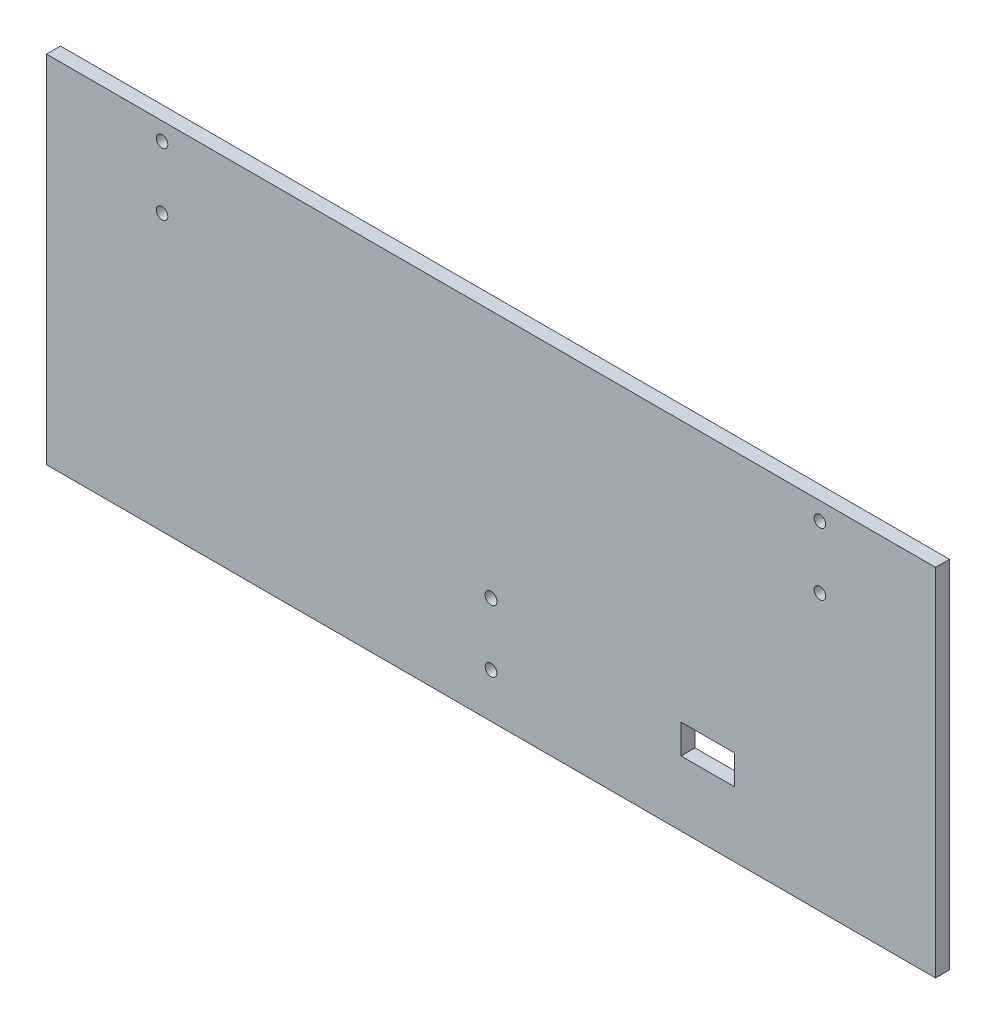
ISO-10303-21;
HEADER;
FILE_DESCRIPTION(('STEP AP214'),'2;1');
FILE_NAME('part.step','',(''),(''),'','','');
FILE_SCHEMA(('AUTOMOTIVE_DESIGN { 1 0 10303 214 1 1 1 1 }'));
ENDSEC;
DATA;
#1=APPLICATION_CONTEXT('core data for automotive mechanical design processes');
#2=APPLICATION_PROTOCOL_DEFINITION('international standard','automotive_design',2000,#1);
#3=PRODUCT_CONTEXT('',#1,'mechanical');
#4=PRODUCT('Part','Part','',(#3));
#5=PRODUCT_RELATED_PRODUCT_CATEGORY('part','',(#4));
#6=PRODUCT_DEFINITION_FORMATION('','',#4);
#7=PRODUCT_DEFINITION_CONTEXT('part definition',#1,'design');
#8=PRODUCT_DEFINITION('design','',#6,#7);
#9=PRODUCT_DEFINITION_SHAPE('','',#8);
#10=(LENGTH_UNIT() NAMED_UNIT(*) SI_UNIT(.MILLI.,.METRE.));
#11=(NAMED_UNIT(*) PLANE_ANGLE_UNIT() SI_UNIT($,.RADIAN.));
#12=(NAMED_UNIT(*) SI_UNIT($,.STERADIAN.) SOLID_ANGLE_UNIT());
#13=UNCERTAINTY_MEASURE_WITH_UNIT(LENGTH_MEASURE(1.E-05),#10,'distance_accuracy_value','');
#14=(GEOMETRIC_REPRESENTATION_CONTEXT(3) GLOBAL_UNCERTAINTY_ASSIGNED_CONTEXT((#13)) GLOBAL_UNIT_ASSIGNED_CONTEXT((#10,
#11,#12)) REPRESENTATION_CONTEXT('',''));
#15=CARTESIAN_POINT('',(0.,0.,0.));
#16=DIRECTION('',(0.,0.,1.));
#17=DIRECTION('',(1.,0.,0.));
#18=AXIS2_PLACEMENT_3D('',#15,#16,#17);
#19=CARTESIAN_POINT('',(0.,0.,4.));
#20=DIRECTION('',(0.,0.,-1.));
#21=DIRECTION('',(-1.,0.,0.));
#22=AXIS2_PLACEMENT_3D('',#19,#20,#21);
#23=PLANE('',#22);
#24=CARTESIAN_POINT('',(220.98,78.74,4.));
#25=DIRECTION('',(0.,0.,1.));
#26=DIRECTION('',(1.,0.,0.));
#27=AXIS2_PLACEMENT_3D('',#24,#25,#26);
#28=CIRCLE('',#27,1.65100000000002);
#29=CARTESIAN_POINT('',(222.631,78.74,4.));
#30=VERTEX_POINT('',#29);
#31=EDGE_CURVE('E160',#30,#30,#28,.T.);
#32=ORIENTED_EDGE('',*,*,#31,.F.);
#33=EDGE_LOOP('',(#32));
#34=FACE_BOUND('',#33,.T.);
#35=CARTESIAN_POINT('',(220.98,96.52,4.));
#36=DIRECTION('',(0.,0.,1.));
#37=DIRECTION('',(1.,0.,0.));
#38=AXIS2_PLACEMENT_3D('',#35,#36,#37);
#39=CIRCLE('',#38,1.65100000000002);
#40=CARTESIAN_POINT('',(222.631,96.52,4.));
#41=VERTEX_POINT('',#40);
#42=EDGE_CURVE('E168',#41,#41,#39,.T.);
#43=ORIENTED_EDGE('',*,*,#42,.F.);
#44=EDGE_LOOP('',(#43));
#45=FACE_BOUND('',#44,.T.);
#46=CARTESIAN_POINT('',(33.0199996785421,78.7446075022681,4.));
#47=DIRECTION('',(0.,0.,1.));
#48=DIRECTION('',(1.,0.,0.));
#49=AXIS2_PLACEMENT_3D('',#46,#47,#48);
#50=CIRCLE('',#49,1.65100000000001);
#51=CARTESIAN_POINT('',(34.6709996785421,78.7446075022681,4.));
#52=VERTEX_POINT('',#51);
#53=EDGE_CURVE('E176',#52,#52,#50,.T.);
#54=ORIENTED_EDGE('',*,*,#53,.F.);
#55=EDGE_LOOP('',(#54));
#56=FACE_BOUND('',#55,.T.);
#57=CARTESIAN_POINT('',(33.02,96.5246075022681,4.));
#58=DIRECTION('',(0.,0.,1.));
#59=DIRECTION('',(1.,0.,0.));
#60=AXIS2_PLACEMENT_3D('',#57,#58,#59);
#61=CIRCLE('',#60,1.65100000000001);
#62=CARTESIAN_POINT('',(34.671,96.5246075022681,4.));
#63=VERTEX_POINT('',#62);
#64=EDGE_CURVE('E184',#63,#63,#61,.T.);
#65=ORIENTED_EDGE('',*,*,#64,.F.);
#66=EDGE_LOOP('',(#65));
#67=FACE_BOUND('',#66,.T.);
#68=DIRECTION('',(0.,-1.,0.));
#69=VECTOR('',#68,1.);
#70=CARTESIAN_POINT('',(0.,0.,4.));
#71=LINE('',#70,#69);
#72=CARTESIAN_POINT('',(0.,101.6,4.));
#73=VERTEX_POINT('',#72);
#74=CARTESIAN_POINT('',(0.,0.,4.));
#75=VERTEX_POINT('',#74);
#76=EDGE_CURVE('E192',#73,#75,#71,.T.);
#77=ORIENTED_EDGE('',*,*,#76,.T.);
#78=DIRECTION('',(1.,0.,0.));
#79=VECTOR('',#78,1.);
#80=CARTESIAN_POINT('',(0.,0.,4.));
#81=LINE('',#80,#79);
#82=CARTESIAN_POINT('',(254.,0.,4.));
#83=VERTEX_POINT('',#82);
#84=EDGE_CURVE('E196',#75,#83,#81,.T.);
#85=ORIENTED_EDGE('',*,*,#84,.T.);
#86=DIRECTION('',(0.,1.,0.));
#87=VECTOR('',#86,1.);
#88=CARTESIAN_POINT('',(254.,101.6,4.));
#89=LINE('',#88,#87);
#90=CARTESIAN_POINT('',(254.,101.6,4.));
#91=VERTEX_POINT('',#90);
#92=EDGE_CURVE('E200',#83,#91,#89,.T.);
#93=ORIENTED_EDGE('',*,*,#92,.T.);
#94=DIRECTION('',(-1.,0.,0.));
#95=VECTOR('',#94,1.);
#96=CARTESIAN_POINT('',(0.,101.6,4.));
#97=LINE('',#96,#95);
#98=EDGE_CURVE('E203',#91,#73,#97,.T.);
#99=ORIENTED_EDGE('',*,*,#98,.T.);
#100=EDGE_LOOP('',(#77,#85,#93,#99));
#101=FACE_BOUND('',#100,.T.);
#102=DIRECTION('',(0.,1.,0.));
#103=VECTOR('',#102,1.);
#104=CARTESIAN_POINT('',(196.576378973253,26.9715919136581,4.));
#105=LINE('',#104,#103);
#106=CARTESIAN_POINT('',(196.576378973253,18.5895919136581,4.));
#107=VERTEX_POINT('',#106);
#108=CARTESIAN_POINT('',(196.576378973253,26.9715919136581,4.));
#109=VERTEX_POINT('',#108);
#110=EDGE_CURVE('E109',#107,#109,#105,.T.);
#111=ORIENTED_EDGE('',*,*,#110,.F.);
#112=DIRECTION('',(1.,0.,0.));
#113=VECTOR('',#112,1.);
#114=CARTESIAN_POINT('',(181.285578973253,18.5895919136581,4.));
#115=LINE('',#114,#113);
#116=CARTESIAN_POINT('',(181.285578973253,18.5895919136581,4.));
#117=VERTEX_POINT('',#116);
#118=EDGE_CURVE('E136',#117,#107,#115,.T.);
#119=ORIENTED_EDGE('',*,*,#118,.F.);
#120=DIRECTION('',(0.,-1.,0.));
#121=VECTOR('',#120,1.);
#122=CARTESIAN_POINT('',(181.285578973253,26.9715919136581,4.));
#123=LINE('',#122,#121);
#124=CARTESIAN_POINT('',(181.285578973253,26.9715919136581,4.));
#125=VERTEX_POINT('',#124);
#126=EDGE_CURVE('E132',#125,#117,#123,.T.);
#127=ORIENTED_EDGE('',*,*,#126,.F.);
#128=DIRECTION('',(-1.,0.,0.));
#129=VECTOR('',#128,1.);
#130=CARTESIAN_POINT('',(181.285578973253,26.9715919136581,4.));
#131=LINE('',#130,#129);
#132=EDGE_CURVE('E118',#109,#125,#131,.T.);
#133=ORIENTED_EDGE('',*,*,#132,.F.);
#134=EDGE_LOOP('',(#111,#119,#127,#133));
#135=FACE_BOUND('',#134,.T.);
#136=CARTESIAN_POINT('',(127.,30.48,4.));
#137=DIRECTION('',(0.,0.,1.));
#138=DIRECTION('',(1.,0.,0.));
#139=AXIS2_PLACEMENT_3D('',#136,#137,#138);
#140=CIRCLE('',#139,1.6891);
#141=CARTESIAN_POINT('',(128.6891,30.48,4.));
#142=VERTEX_POINT('',#141);
#143=EDGE_CURVE('E144',#142,#142,#140,.T.);
#144=ORIENTED_EDGE('',*,*,#143,.F.);
#145=EDGE_LOOP('',(#144));
#146=FACE_BOUND('',#145,.T.);
#147=CARTESIAN_POINT('',(127.,12.7,4.));
#148=DIRECTION('',(0.,0.,1.));
#149=DIRECTION('',(1.,0.,0.));
#150=AXIS2_PLACEMENT_3D('',#147,#148,#149);
#151=CIRCLE('',#150,1.66369999999999);
#152=CARTESIAN_POINT('',(128.6637,12.7,4.));
#153=VERTEX_POINT('',#152);
#154=EDGE_CURVE('E317',#153,#153,#151,.T.);
#155=ORIENTED_EDGE('',*,*,#154,.F.);
#156=EDGE_LOOP('',(#155));
#157=FACE_BOUND('',#156,.T.);
#158=ADVANCED_FACE('F43',(#34,#45,#56,#67,#101,#135,#146,#157),#23,.F.);
#159=CARTESIAN_POINT('',(0.,0.,0.));
#160=DIRECTION('',(0.,0.,-1.));
#161=DIRECTION('',(-1.,0.,0.));
#162=AXIS2_PLACEMENT_3D('',#159,#160,#161);
#163=PLANE('',#162);
#164=CARTESIAN_POINT('',(127.,30.48,0.));
#165=DIRECTION('',(0.,0.,1.));
#166=DIRECTION('',(1.,0.,0.));
#167=AXIS2_PLACEMENT_3D('',#164,#165,#166);
#168=CIRCLE('',#167,1.6891);
#169=CARTESIAN_POINT('',(128.6891,30.48,0.));
#170=VERTEX_POINT('',#169);
#171=EDGE_CURVE('E325',#170,#170,#168,.T.);
#172=ORIENTED_EDGE('',*,*,#171,.T.);
#173=EDGE_LOOP('',(#172));
#174=FACE_BOUND('',#173,.T.);
#175=CARTESIAN_POINT('',(220.98,96.52,0.));
#176=DIRECTION('',(0.,0.,1.));
#177=DIRECTION('',(1.,0.,0.));
#178=AXIS2_PLACEMENT_3D('',#175,#176,#177);
#179=CIRCLE('',#178,1.65100000000002);
#180=CARTESIAN_POINT('',(222.631,96.52,0.));
#181=VERTEX_POINT('',#180);
#182=EDGE_CURVE('E164',#181,#181,#179,.T.);
#183=ORIENTED_EDGE('',*,*,#182,.T.);
#184=EDGE_LOOP('',(#183));
#185=FACE_BOUND('',#184,.T.);
#186=CARTESIAN_POINT('',(33.02,96.5246075022681,0.));
#187=DIRECTION('',(0.,0.,1.));
#188=DIRECTION('',(1.,0.,0.));
#189=AXIS2_PLACEMENT_3D('',#186,#187,#188);
#190=CIRCLE('',#189,1.65100000000001);
#191=CARTESIAN_POINT('',(34.671,96.5246075022681,0.));
#192=VERTEX_POINT('',#191);
#193=EDGE_CURVE('E180',#192,#192,#190,.T.);
#194=ORIENTED_EDGE('',*,*,#193,.T.);
#195=EDGE_LOOP('',(#194));
#196=FACE_BOUND('',#195,.T.);
#197=DIRECTION('',(0.,-1.,0.));
#198=VECTOR('',#197,1.);
#199=CARTESIAN_POINT('',(0.,0.,0.));
#200=LINE('',#199,#198);
#201=CARTESIAN_POINT('',(0.,101.6,0.));
#202=VERTEX_POINT('',#201);
#203=CARTESIAN_POINT('',(0.,0.,0.));
#204=VERTEX_POINT('',#203);
#205=EDGE_CURVE('E188',#202,#204,#200,.T.);
#206=ORIENTED_EDGE('',*,*,#205,.F.);
#207=DIRECTION('',(-1.,0.,0.));
#208=VECTOR('',#207,1.);
#209=CARTESIAN_POINT('',(0.,101.6,0.));
#210=LINE('',#209,#208);
#211=CARTESIAN_POINT('',(254.,101.6,0.));
#212=VERTEX_POINT('',#211);
#213=EDGE_CURVE('E197',#212,#202,#210,.T.);
#214=ORIENTED_EDGE('',*,*,#213,.F.);
#215=DIRECTION('',(0.,1.,0.));
#216=VECTOR('',#215,1.);
#217=CARTESIAN_POINT('',(254.,101.6,0.));
#218=LINE('',#217,#216);
#219=CARTESIAN_POINT('',(254.,0.,0.));
#220=VERTEX_POINT('',#219);
#221=EDGE_CURVE('E213',#220,#212,#218,.T.);
#222=ORIENTED_EDGE('',*,*,#221,.F.);
#223=DIRECTION('',(1.,0.,0.));
#224=VECTOR('',#223,1.);
#225=CARTESIAN_POINT('',(0.,0.,0.));
#226=LINE('',#225,#224);
#227=EDGE_CURVE('E210',#204,#220,#226,.T.);
#228=ORIENTED_EDGE('',*,*,#227,.F.);
#229=EDGE_LOOP('',(#206,#214,#222,#228));
#230=FACE_BOUND('',#229,.T.);
#231=CARTESIAN_POINT('',(33.0199996785421,78.7446075022681,0.));
#232=DIRECTION('',(0.,0.,1.));
#233=DIRECTION('',(1.,0.,0.));
#234=AXIS2_PLACEMENT_3D('',#231,#232,#233);
#235=CIRCLE('',#234,1.65100000000001);
#236=CARTESIAN_POINT('',(34.6709996785421,78.7446075022681,0.));
#237=VERTEX_POINT('',#236);
#238=EDGE_CURVE('E172',#237,#237,#235,.T.);
#239=ORIENTED_EDGE('',*,*,#238,.T.);
#240=EDGE_LOOP('',(#239));
#241=FACE_BOUND('',#240,.T.);
#242=CARTESIAN_POINT('',(220.98,78.74,0.));
#243=DIRECTION('',(0.,0.,1.));
#244=DIRECTION('',(1.,0.,0.));
#245=AXIS2_PLACEMENT_3D('',#242,#243,#244);
#246=CIRCLE('',#245,1.65100000000002);
#247=CARTESIAN_POINT('',(222.631,78.74,0.));
#248=VERTEX_POINT('',#247);
#249=EDGE_CURVE('E127',#248,#248,#246,.T.);
#250=ORIENTED_EDGE('',*,*,#249,.T.);
#251=EDGE_LOOP('',(#250));
#252=FACE_BOUND('',#251,.T.);
#253=DIRECTION('',(1.,0.,0.));
#254=VECTOR('',#253,1.);
#255=CARTESIAN_POINT('',(181.285578973253,18.5895919136581,0.));
#256=LINE('',#255,#254);
#257=CARTESIAN_POINT('',(181.285578973253,18.5895919136581,0.));
#258=VERTEX_POINT('',#257);
#259=CARTESIAN_POINT('',(196.576378973253,18.5895919136581,0.));
#260=VERTEX_POINT('',#259);
#261=EDGE_CURVE('E119',#258,#260,#256,.T.);
#262=ORIENTED_EDGE('',*,*,#261,.T.);
#263=DIRECTION('',(0.,1.,0.));
#264=VECTOR('',#263,1.);
#265=CARTESIAN_POINT('',(196.576378973253,26.9715919136581,0.));
#266=LINE('',#265,#264);
#267=CARTESIAN_POINT('',(196.576378973253,26.9715919136581,0.));
#268=VERTEX_POINT('',#267);
#269=EDGE_CURVE('E67',#260,#268,#266,.T.);
#270=ORIENTED_EDGE('',*,*,#269,.T.);
#271=DIRECTION('',(-1.,0.,0.));
#272=VECTOR('',#271,1.);
#273=CARTESIAN_POINT('',(181.285578973253,26.9715919136581,0.));
#274=LINE('',#273,#272);
#275=CARTESIAN_POINT('',(181.285578973253,26.9715919136581,0.));
#276=VERTEX_POINT('',#275);
#277=EDGE_CURVE('E125',#268,#276,#274,.T.);
#278=ORIENTED_EDGE('',*,*,#277,.T.);
#279=DIRECTION('',(0.,-1.,0.));
#280=VECTOR('',#279,1.);
#281=CARTESIAN_POINT('',(181.285578973253,26.9715919136581,0.));
#282=LINE('',#281,#280);
#283=EDGE_CURVE('E147',#276,#258,#282,.T.);
#284=ORIENTED_EDGE('',*,*,#283,.T.);
#285=EDGE_LOOP('',(#262,#270,#278,#284));
#286=FACE_BOUND('',#285,.T.);
#287=CARTESIAN_POINT('',(127.,12.7,0.));
#288=DIRECTION('',(0.,0.,1.));
#289=DIRECTION('',(1.,0.,0.));
#290=AXIS2_PLACEMENT_3D('',#287,#288,#289);
#291=CIRCLE('',#290,1.66369999999999);
#292=CARTESIAN_POINT('',(128.6637,12.7,0.));
#293=VERTEX_POINT('',#292);
#294=EDGE_CURVE('E320',#293,#293,#291,.T.);
#295=ORIENTED_EDGE('',*,*,#294,.T.);
#296=EDGE_LOOP('',(#295));
#297=FACE_BOUND('',#296,.T.);
#298=ADVANCED_FACE('F236',(#174,#185,#196,#230,#241,#252,#286,#297),#163,.T.);
#299=CARTESIAN_POINT('',(0.,0.,4.));
#300=DIRECTION('',(1.,0.,0.));
#301=DIRECTION('',(0.,0.,-1.));
#302=AXIS2_PLACEMENT_3D('',#299,#300,#301);
#303=PLANE('',#302);
#304=ORIENTED_EDGE('',*,*,#205,.T.);
#305=DIRECTION('',(0.,0.,-1.));
#306=VECTOR('',#305,1.);
#307=CARTESIAN_POINT('',(0.,0.,4.));
#308=LINE('',#307,#306);
#309=EDGE_CURVE('E11',#75,#204,#308,.T.);
#310=ORIENTED_EDGE('',*,*,#309,.F.);
#311=ORIENTED_EDGE('',*,*,#76,.F.);
#312=DIRECTION('',(0.,0.,-1.));
#313=VECTOR('',#312,1.);
#314=CARTESIAN_POINT('',(0.,101.6,4.));
#315=LINE('',#314,#313);
#316=EDGE_CURVE('E206',#73,#202,#315,.T.);
#317=ORIENTED_EDGE('',*,*,#316,.T.);
#318=EDGE_LOOP('',(#304,#310,#311,#317));
#319=FACE_BOUND('',#318,.T.);
#320=ADVANCED_FACE('F45',(#319),#303,.F.);
#321=CARTESIAN_POINT('',(0.,0.,4.));
#322=DIRECTION('',(0.,1.,0.));
#323=DIRECTION('',(0.,0.,1.));
#324=AXIS2_PLACEMENT_3D('',#321,#322,#323);
#325=PLANE('',#324);
#326=ORIENTED_EDGE('',*,*,#227,.T.);
#327=DIRECTION('',(0.,0.,-1.));
#328=VECTOR('',#327,1.);
#329=CARTESIAN_POINT('',(254.,0.,4.));
#330=LINE('',#329,#328);
#331=EDGE_CURVE('E52',#83,#220,#330,.T.);
#332=ORIENTED_EDGE('',*,*,#331,.F.);
#333=ORIENTED_EDGE('',*,*,#84,.F.);
#334=ORIENTED_EDGE('',*,*,#309,.T.);
#335=EDGE_LOOP('',(#326,#332,#333,#334));
#336=FACE_BOUND('',#335,.T.);
#337=ADVANCED_FACE('F246',(#336),#325,.F.);
#338=CARTESIAN_POINT('',(254.,101.6,4.));
#339=DIRECTION('',(-1.,0.,0.));
#340=DIRECTION('',(0.,0.,1.));
#341=AXIS2_PLACEMENT_3D('',#338,#339,#340);
#342=PLANE('',#341);
#343=ORIENTED_EDGE('',*,*,#221,.T.);
#344=DIRECTION('',(0.,0.,-1.));
#345=VECTOR('',#344,1.);
#346=CARTESIAN_POINT('',(254.,101.6,4.));
#347=LINE('',#346,#345);
#348=EDGE_CURVE('E221',#91,#212,#347,.T.);
#349=ORIENTED_EDGE('',*,*,#348,.F.);
#350=ORIENTED_EDGE('',*,*,#92,.F.);
#351=ORIENTED_EDGE('',*,*,#331,.T.);
#352=EDGE_LOOP('',(#343,#349,#350,#351));
#353=FACE_BOUND('',#352,.T.);
#354=ADVANCED_FACE('F230',(#353),#342,.F.);
#355=CARTESIAN_POINT('',(0.,101.6,4.));
#356=DIRECTION('',(0.,-1.,0.));
#357=DIRECTION('',(0.,0.,-1.));
#358=AXIS2_PLACEMENT_3D('',#355,#356,#357);
#359=PLANE('',#358);
#360=ORIENTED_EDGE('',*,*,#213,.T.);
#361=ORIENTED_EDGE('',*,*,#316,.F.);
#362=ORIENTED_EDGE('',*,*,#98,.F.);
#363=ORIENTED_EDGE('',*,*,#348,.T.);
#364=EDGE_LOOP('',(#360,#361,#362,#363));
#365=FACE_BOUND('',#364,.T.);
#366=ADVANCED_FACE('F240',(#365),#359,.F.);
#367=CARTESIAN_POINT('',(33.02,96.5246075022681,4.));
#368=DIRECTION('',(0.,0.,-1.));
#369=DIRECTION('',(-1.,0.,0.));
#370=AXIS2_PLACEMENT_3D('',#367,#368,#369);
#371=CYLINDRICAL_SURFACE('',#370,1.65100000000001);
#372=ORIENTED_EDGE('',*,*,#64,.T.);
#373=EDGE_LOOP('',(#372));
#374=FACE_BOUND('',#373,.T.);
#375=ORIENTED_EDGE('',*,*,#193,.F.);
#376=EDGE_LOOP('',(#375));
#377=FACE_BOUND('',#376,.T.);
#378=ADVANCED_FACE('F264',(#374,#377),#371,.F.);
#379=CARTESIAN_POINT('',(33.0199996785421,78.7446075022681,4.));
#380=DIRECTION('',(0.,0.,-1.));
#381=DIRECTION('',(-1.,0.,0.));
#382=AXIS2_PLACEMENT_3D('',#379,#380,#381);
#383=CYLINDRICAL_SURFACE('',#382,1.65100000000001);
#384=ORIENTED_EDGE('',*,*,#53,.T.);
#385=EDGE_LOOP('',(#384));
#386=FACE_BOUND('',#385,.T.);
#387=ORIENTED_EDGE('',*,*,#238,.F.);
#388=EDGE_LOOP('',(#387));
#389=FACE_BOUND('',#388,.T.);
#390=ADVANCED_FACE('F271',(#386,#389),#383,.F.);
#391=CARTESIAN_POINT('',(220.98,96.52,4.));
#392=DIRECTION('',(0.,0.,-1.));
#393=DIRECTION('',(-1.,0.,0.));
#394=AXIS2_PLACEMENT_3D('',#391,#392,#393);
#395=CYLINDRICAL_SURFACE('',#394,1.65100000000002);
#396=ORIENTED_EDGE('',*,*,#42,.T.);
#397=EDGE_LOOP('',(#396));
#398=FACE_BOUND('',#397,.T.);
#399=ORIENTED_EDGE('',*,*,#182,.F.);
#400=EDGE_LOOP('',(#399));
#401=FACE_BOUND('',#400,.T.);
#402=ADVANCED_FACE('F276',(#398,#401),#395,.F.);
#403=CARTESIAN_POINT('',(220.98,78.74,4.));
#404=DIRECTION('',(0.,0.,-1.));
#405=DIRECTION('',(-1.,0.,0.));
#406=AXIS2_PLACEMENT_3D('',#403,#404,#405);
#407=CYLINDRICAL_SURFACE('',#406,1.65100000000002);
#408=ORIENTED_EDGE('',*,*,#31,.T.);
#409=EDGE_LOOP('',(#408));
#410=FACE_BOUND('',#409,.T.);
#411=ORIENTED_EDGE('',*,*,#249,.F.);
#412=EDGE_LOOP('',(#411));
#413=FACE_BOUND('',#412,.T.);
#414=ADVANCED_FACE('F286',(#410,#413),#407,.F.);
#415=CARTESIAN_POINT('',(196.576378973253,26.9715919136581,4.));
#416=DIRECTION('',(-1.,0.,0.));
#417=DIRECTION('',(0.,0.,1.));
#418=AXIS2_PLACEMENT_3D('',#415,#416,#417);
#419=PLANE('',#418);
#420=ORIENTED_EDGE('',*,*,#269,.F.);
#421=DIRECTION('',(0.,0.,-1.));
#422=VECTOR('',#421,1.);
#423=CARTESIAN_POINT('',(196.576378973253,18.5895919136581,4.));
#424=LINE('',#423,#422);
#425=EDGE_CURVE('E113',#107,#260,#424,.T.);
#426=ORIENTED_EDGE('',*,*,#425,.F.);
#427=ORIENTED_EDGE('',*,*,#110,.T.);
#428=DIRECTION('',(0.,0.,-1.));
#429=VECTOR('',#428,1.);
#430=CARTESIAN_POINT('',(196.576378973253,26.9715919136581,4.));
#431=LINE('',#430,#429);
#432=EDGE_CURVE('E112',#109,#268,#431,.T.);
#433=ORIENTED_EDGE('',*,*,#432,.T.);
#434=EDGE_LOOP('',(#420,#426,#427,#433));
#435=FACE_BOUND('',#434,.T.);
#436=ADVANCED_FACE('F111',(#435),#419,.T.);
#437=CARTESIAN_POINT('',(181.285578973253,26.9715919136581,4.));
#438=DIRECTION('',(0.,-1.,0.));
#439=DIRECTION('',(0.,0.,-1.));
#440=AXIS2_PLACEMENT_3D('',#437,#438,#439);
#441=PLANE('',#440);
#442=ORIENTED_EDGE('',*,*,#277,.F.);
#443=ORIENTED_EDGE('',*,*,#432,.F.);
#444=ORIENTED_EDGE('',*,*,#132,.T.);
#445=DIRECTION('',(0.,0.,-1.));
#446=VECTOR('',#445,1.);
#447=CARTESIAN_POINT('',(181.285578973253,26.9715919136581,4.));
#448=LINE('',#447,#446);
#449=EDGE_CURVE('E128',#125,#276,#448,.T.);
#450=ORIENTED_EDGE('',*,*,#449,.T.);
#451=EDGE_LOOP('',(#442,#443,#444,#450));
#452=FACE_BOUND('',#451,.T.);
#453=ADVANCED_FACE('F122',(#452),#441,.T.);
#454=CARTESIAN_POINT('',(181.285578973253,26.9715919136581,4.));
#455=DIRECTION('',(1.,0.,0.));
#456=DIRECTION('',(0.,0.,-1.));
#457=AXIS2_PLACEMENT_3D('',#454,#455,#456);
#458=PLANE('',#457);
#459=ORIENTED_EDGE('',*,*,#283,.F.);
#460=ORIENTED_EDGE('',*,*,#449,.F.);
#461=ORIENTED_EDGE('',*,*,#126,.T.);
#462=DIRECTION('',(0.,0.,-1.));
#463=VECTOR('',#462,1.);
#464=CARTESIAN_POINT('',(181.285578973253,18.5895919136581,4.));
#465=LINE('',#464,#463);
#466=EDGE_CURVE('E59',#117,#258,#465,.T.);
#467=ORIENTED_EDGE('',*,*,#466,.T.);
#468=EDGE_LOOP('',(#459,#460,#461,#467));
#469=FACE_BOUND('',#468,.T.);
#470=ADVANCED_FACE('F298',(#469),#458,.T.);
#471=CARTESIAN_POINT('',(181.285578973253,18.5895919136581,4.));
#472=DIRECTION('',(0.,1.,0.));
#473=DIRECTION('',(0.,0.,1.));
#474=AXIS2_PLACEMENT_3D('',#471,#472,#473);
#475=PLANE('',#474);
#476=ORIENTED_EDGE('',*,*,#261,.F.);
#477=ORIENTED_EDGE('',*,*,#466,.F.);
#478=ORIENTED_EDGE('',*,*,#118,.T.);
#479=ORIENTED_EDGE('',*,*,#425,.T.);
#480=EDGE_LOOP('',(#476,#477,#478,#479));
#481=FACE_BOUND('',#480,.T.);
#482=ADVANCED_FACE('F301',(#481),#475,.T.);
#483=CARTESIAN_POINT('',(127.,30.48,4.));
#484=DIRECTION('',(0.,0.,-1.));
#485=DIRECTION('',(-1.,0.,0.));
#486=AXIS2_PLACEMENT_3D('',#483,#484,#485);
#487=CYLINDRICAL_SURFACE('',#486,1.6891);
#488=ORIENTED_EDGE('',*,*,#143,.T.);
#489=EDGE_LOOP('',(#488));
#490=FACE_BOUND('',#489,.T.);
#491=ORIENTED_EDGE('',*,*,#171,.F.);
#492=EDGE_LOOP('',(#491));
#493=FACE_BOUND('',#492,.T.);
#494=ADVANCED_FACE('F305',(#490,#493),#487,.F.);
#495=CARTESIAN_POINT('',(127.,12.7,4.));
#496=DIRECTION('',(0.,0.,-1.));
#497=DIRECTION('',(-1.,0.,0.));
#498=AXIS2_PLACEMENT_3D('',#495,#496,#497);
#499=CYLINDRICAL_SURFACE('',#498,1.66369999999999);
#500=ORIENTED_EDGE('',*,*,#154,.T.);
#501=EDGE_LOOP('',(#500));
#502=FACE_BOUND('',#501,.T.);
#503=ORIENTED_EDGE('',*,*,#294,.F.);
#504=EDGE_LOOP('',(#503));
#505=FACE_BOUND('',#504,.T.);
#506=ADVANCED_FACE('F308',(#502,#505),#499,.F.);
#507=CLOSED_SHELL('',(#158,#298,#320,#337,#354,#366,#378,#390,#402,#414,#436,#453,#470,#482,
#494,#506));
#508=MANIFOLD_SOLID_BREP('B2',#507);
#509=ADVANCED_BREP_SHAPE_REPRESENTATION('',(#18,#508),#14);
#510=SHAPE_DEFINITION_REPRESENTATION(#9,#509);
ENDSEC;
END-ISO-10303-21;
